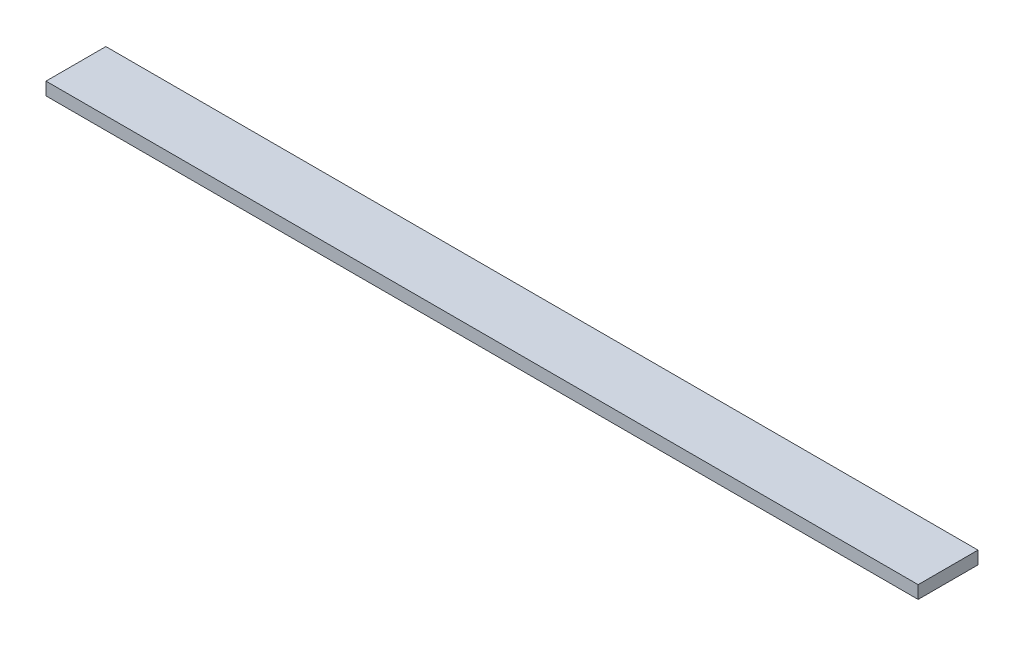
ISO-10303-21;
HEADER;
FILE_DESCRIPTION(('STEP AP214'),'2;1');
FILE_NAME('part.step','',(''),(''),'','','');
FILE_SCHEMA(('AUTOMOTIVE_DESIGN { 1 0 10303 214 1 1 1 1 }'));
ENDSEC;
DATA;
#1=APPLICATION_CONTEXT('core data for automotive mechanical design processes');
#2=APPLICATION_PROTOCOL_DEFINITION('international standard','automotive_design',2000,#1);
#3=PRODUCT_CONTEXT('',#1,'mechanical');
#4=PRODUCT('Part','Part','',(#3));
#5=PRODUCT_RELATED_PRODUCT_CATEGORY('part','',(#4));
#6=PRODUCT_DEFINITION_FORMATION('','',#4);
#7=PRODUCT_DEFINITION_CONTEXT('part definition',#1,'design');
#8=PRODUCT_DEFINITION('design','',#6,#7);
#9=PRODUCT_DEFINITION_SHAPE('','',#8);
#10=(LENGTH_UNIT() NAMED_UNIT(*) SI_UNIT(.MILLI.,.METRE.));
#11=(NAMED_UNIT(*) PLANE_ANGLE_UNIT() SI_UNIT($,.RADIAN.));
#12=(NAMED_UNIT(*) SI_UNIT($,.STERADIAN.) SOLID_ANGLE_UNIT());
#13=UNCERTAINTY_MEASURE_WITH_UNIT(LENGTH_MEASURE(1.E-05),#10,'distance_accuracy_value','');
#14=(GEOMETRIC_REPRESENTATION_CONTEXT(3) GLOBAL_UNCERTAINTY_ASSIGNED_CONTEXT((#13)) GLOBAL_UNIT_ASSIGNED_CONTEXT((#10,
#11,#12)) REPRESENTATION_CONTEXT('',''));
#15=CARTESIAN_POINT('',(0.,0.,0.));
#16=DIRECTION('',(0.,0.,1.));
#17=DIRECTION('',(1.,0.,0.));
#18=AXIS2_PLACEMENT_3D('',#15,#16,#17);
#19=CARTESIAN_POINT('',(130.,140.,-248.));
#20=DIRECTION('',(-1.,0.,0.));
#21=DIRECTION('',(0.,0.,1.));
#22=AXIS2_PLACEMENT_3D('',#19,#20,#21);
#23=PLANE('',#22);
#24=DIRECTION('',(0.,-1.,0.));
#25=VECTOR('',#24,1.);
#26=CARTESIAN_POINT('',(130.,140.,-213.));
#27=LINE('',#26,#25);
#28=CARTESIAN_POINT('',(130.,147.5,-213.));
#29=VERTEX_POINT('',#28);
#30=CARTESIAN_POINT('',(130.,140.,-213.));
#31=VERTEX_POINT('',#30);
#32=EDGE_CURVE('E103',#29,#31,#27,.T.);
#33=ORIENTED_EDGE('',*,*,#32,.F.);
#34=DIRECTION('',(0.,0.,1.));
#35=VECTOR('',#34,1.);
#36=CARTESIAN_POINT('',(130.,147.5,-248.));
#37=LINE('',#36,#35);
#38=CARTESIAN_POINT('',(130.,147.5,-248.));
#39=VERTEX_POINT('',#38);
#40=EDGE_CURVE('E11',#39,#29,#37,.T.);
#41=ORIENTED_EDGE('',*,*,#40,.F.);
#42=DIRECTION('',(0.,-1.,0.));
#43=VECTOR('',#42,1.);
#44=CARTESIAN_POINT('',(130.,140.,-248.));
#45=LINE('',#44,#43);
#46=CARTESIAN_POINT('',(130.,140.,-248.));
#47=VERTEX_POINT('',#46);
#48=EDGE_CURVE('E97',#39,#47,#45,.T.);
#49=ORIENTED_EDGE('',*,*,#48,.T.);
#50=DIRECTION('',(0.,0.,1.));
#51=VECTOR('',#50,1.);
#52=CARTESIAN_POINT('',(130.,140.,-248.));
#53=LINE('',#52,#51);
#54=EDGE_CURVE('E42',#47,#31,#53,.T.);
#55=ORIENTED_EDGE('',*,*,#54,.T.);
#56=EDGE_LOOP('',(#33,#41,#49,#55));
#57=FACE_BOUND('',#56,.T.);
#58=ADVANCED_FACE('F39',(#57),#23,.T.);
#59=CARTESIAN_POINT('',(130.,147.5,-248.));
#60=DIRECTION('',(0.,1.,0.));
#61=DIRECTION('',(0.,0.,1.));
#62=AXIS2_PLACEMENT_3D('',#59,#60,#61);
#63=PLANE('',#62);
#64=DIRECTION('',(-1.,0.,0.));
#65=VECTOR('',#64,1.);
#66=CARTESIAN_POINT('',(130.,147.5,-213.));
#67=LINE('',#66,#65);
#68=CARTESIAN_POINT('',(640.,147.5,-213.));
#69=VERTEX_POINT('',#68);
#70=EDGE_CURVE('E99',#69,#29,#67,.T.);
#71=ORIENTED_EDGE('',*,*,#70,.F.);
#72=DIRECTION('',(0.,0.,1.));
#73=VECTOR('',#72,1.);
#74=CARTESIAN_POINT('',(640.,147.5,-248.));
#75=LINE('',#74,#73);
#76=CARTESIAN_POINT('',(640.,147.5,-248.));
#77=VERTEX_POINT('',#76);
#78=EDGE_CURVE('E48',#77,#69,#75,.T.);
#79=ORIENTED_EDGE('',*,*,#78,.F.);
#80=DIRECTION('',(-1.,0.,0.));
#81=VECTOR('',#80,1.);
#82=CARTESIAN_POINT('',(130.,147.5,-248.));
#83=LINE('',#82,#81);
#84=EDGE_CURVE('E94',#77,#39,#83,.T.);
#85=ORIENTED_EDGE('',*,*,#84,.T.);
#86=ORIENTED_EDGE('',*,*,#40,.T.);
#87=EDGE_LOOP('',(#71,#79,#85,#86));
#88=FACE_BOUND('',#87,.T.);
#89=ADVANCED_FACE('F113',(#88),#63,.T.);
#90=CARTESIAN_POINT('',(640.,140.,-248.));
#91=DIRECTION('',(1.,0.,0.));
#92=DIRECTION('',(0.,0.,-1.));
#93=AXIS2_PLACEMENT_3D('',#90,#91,#92);
#94=PLANE('',#93);
#95=DIRECTION('',(0.,1.,0.));
#96=VECTOR('',#95,1.);
#97=CARTESIAN_POINT('',(640.,140.,-213.));
#98=LINE('',#97,#96);
#99=CARTESIAN_POINT('',(640.,140.,-213.));
#100=VERTEX_POINT('',#99);
#101=EDGE_CURVE('E89',#100,#69,#98,.T.);
#102=ORIENTED_EDGE('',*,*,#101,.F.);
#103=DIRECTION('',(0.,0.,1.));
#104=VECTOR('',#103,1.);
#105=CARTESIAN_POINT('',(640.,140.,-248.));
#106=LINE('',#105,#104);
#107=CARTESIAN_POINT('',(640.,140.,-248.));
#108=VERTEX_POINT('',#107);
#109=EDGE_CURVE('E84',#108,#100,#106,.T.);
#110=ORIENTED_EDGE('',*,*,#109,.F.);
#111=DIRECTION('',(0.,1.,0.));
#112=VECTOR('',#111,1.);
#113=CARTESIAN_POINT('',(640.,140.,-248.));
#114=LINE('',#113,#112);
#115=EDGE_CURVE('E87',#108,#77,#114,.T.);
#116=ORIENTED_EDGE('',*,*,#115,.T.);
#117=ORIENTED_EDGE('',*,*,#78,.T.);
#118=EDGE_LOOP('',(#102,#110,#116,#117));
#119=FACE_BOUND('',#118,.T.);
#120=ADVANCED_FACE('F86',(#119),#94,.T.);
#121=CARTESIAN_POINT('',(130.,140.,-248.));
#122=DIRECTION('',(0.,-1.,0.));
#123=DIRECTION('',(0.,0.,-1.));
#124=AXIS2_PLACEMENT_3D('',#121,#122,#123);
#125=PLANE('',#124);
#126=DIRECTION('',(1.,0.,0.));
#127=VECTOR('',#126,1.);
#128=CARTESIAN_POINT('',(130.,140.,-213.));
#129=LINE('',#128,#127);
#130=EDGE_CURVE('E106',#31,#100,#129,.T.);
#131=ORIENTED_EDGE('',*,*,#130,.F.);
#132=ORIENTED_EDGE('',*,*,#54,.F.);
#133=DIRECTION('',(1.,0.,0.));
#134=VECTOR('',#133,1.);
#135=CARTESIAN_POINT('',(130.,140.,-248.));
#136=LINE('',#135,#134);
#137=EDGE_CURVE('E93',#47,#108,#136,.T.);
#138=ORIENTED_EDGE('',*,*,#137,.T.);
#139=ORIENTED_EDGE('',*,*,#109,.T.);
#140=EDGE_LOOP('',(#131,#132,#138,#139));
#141=FACE_BOUND('',#140,.T.);
#142=ADVANCED_FACE('F96',(#141),#125,.T.);
#143=CARTESIAN_POINT('',(0.,0.,-248.));
#144=DIRECTION('',(0.,0.,-1.));
#145=DIRECTION('',(-1.,0.,0.));
#146=AXIS2_PLACEMENT_3D('',#143,#144,#145);
#147=PLANE('',#146);
#148=ORIENTED_EDGE('',*,*,#48,.F.);
#149=ORIENTED_EDGE('',*,*,#84,.F.);
#150=ORIENTED_EDGE('',*,*,#115,.F.);
#151=ORIENTED_EDGE('',*,*,#137,.F.);
#152=EDGE_LOOP('',(#148,#149,#150,#151));
#153=FACE_BOUND('',#152,.T.);
#154=ADVANCED_FACE('F92',(#153),#147,.T.);
#155=CARTESIAN_POINT('',(0.,0.,-213.));
#156=DIRECTION('',(0.,0.,-1.));
#157=DIRECTION('',(-1.,0.,0.));
#158=AXIS2_PLACEMENT_3D('',#155,#156,#157);
#159=PLANE('',#158);
#160=ORIENTED_EDGE('',*,*,#32,.T.);
#161=ORIENTED_EDGE('',*,*,#130,.T.);
#162=ORIENTED_EDGE('',*,*,#101,.T.);
#163=ORIENTED_EDGE('',*,*,#70,.T.);
#164=EDGE_LOOP('',(#160,#161,#162,#163));
#165=FACE_BOUND('',#164,.T.);
#166=ADVANCED_FACE('F112',(#165),#159,.F.);
#167=CLOSED_SHELL('',(#58,#89,#120,#142,#154,#166));
#168=MANIFOLD_SOLID_BREP('B2',#167);
#169=ADVANCED_BREP_SHAPE_REPRESENTATION('',(#18,#168),#14);
#170=SHAPE_DEFINITION_REPRESENTATION(#9,#169);
ENDSEC;
END-ISO-10303-21;
